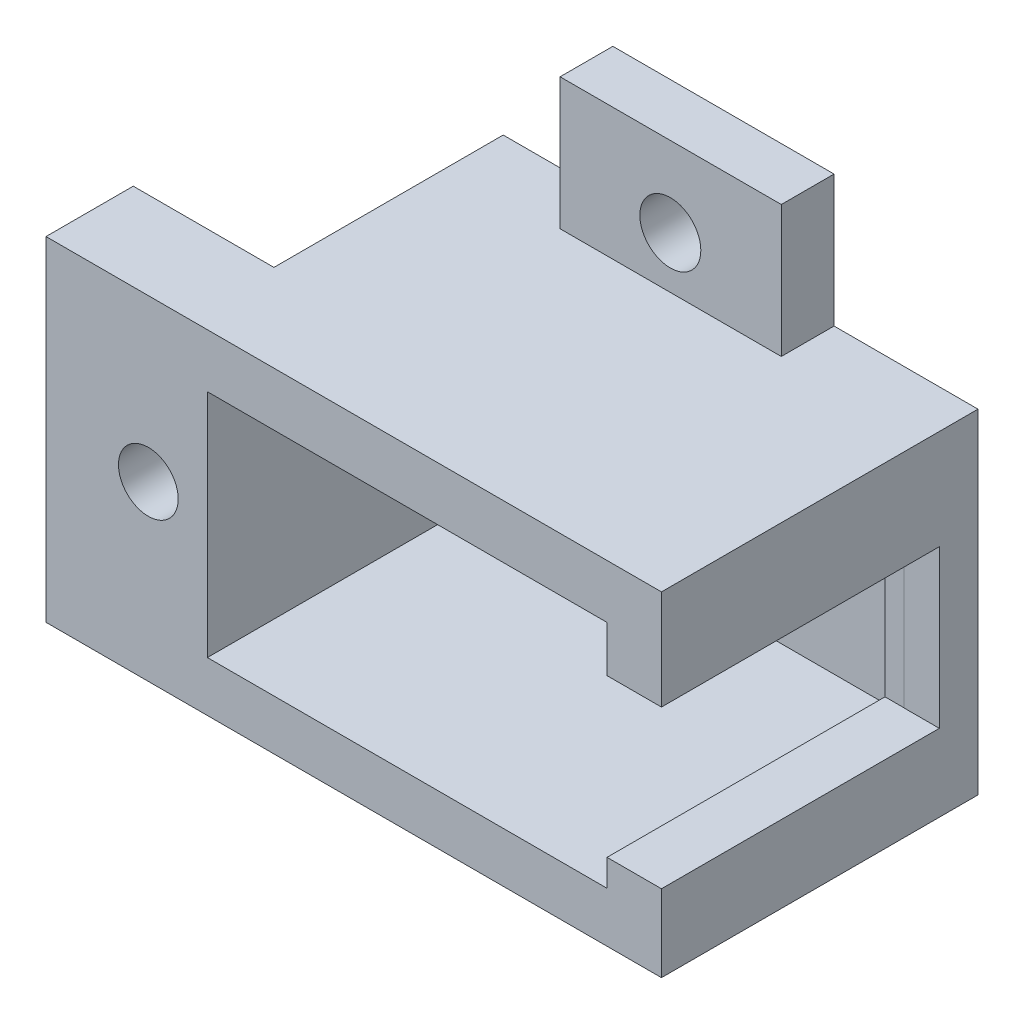
ISO-10303-21;
HEADER;
FILE_DESCRIPTION(('STEP AP214'),'2;1');
FILE_NAME('part.step','',(''),(''),'','','');
FILE_SCHEMA(('AUTOMOTIVE_DESIGN { 1 0 10303 214 1 1 1 1 }'));
ENDSEC;
DATA;
#1=APPLICATION_CONTEXT('core data for automotive mechanical design processes');
#2=APPLICATION_PROTOCOL_DEFINITION('international standard','automotive_design',2000,#1);
#3=PRODUCT_CONTEXT('',#1,'mechanical');
#4=PRODUCT('Part','Part','',(#3));
#5=PRODUCT_RELATED_PRODUCT_CATEGORY('part','',(#4));
#6=PRODUCT_DEFINITION_FORMATION('','',#4);
#7=PRODUCT_DEFINITION_CONTEXT('part definition',#1,'design');
#8=PRODUCT_DEFINITION('design','',#6,#7);
#9=PRODUCT_DEFINITION_SHAPE('','',#8);
#10=(LENGTH_UNIT() NAMED_UNIT(*) SI_UNIT(.MILLI.,.METRE.));
#11=(NAMED_UNIT(*) PLANE_ANGLE_UNIT() SI_UNIT($,.RADIAN.));
#12=(NAMED_UNIT(*) SI_UNIT($,.STERADIAN.) SOLID_ANGLE_UNIT());
#13=UNCERTAINTY_MEASURE_WITH_UNIT(LENGTH_MEASURE(1.E-05),#10,'distance_accuracy_value','');
#14=(GEOMETRIC_REPRESENTATION_CONTEXT(3) GLOBAL_UNCERTAINTY_ASSIGNED_CONTEXT((#13)) GLOBAL_UNIT_ASSIGNED_CONTEXT((#10,
#11,#12)) REPRESENTATION_CONTEXT('',''));
#15=CARTESIAN_POINT('',(0.,0.,0.));
#16=DIRECTION('',(0.,0.,1.));
#17=DIRECTION('',(1.,0.,0.));
#18=AXIS2_PLACEMENT_3D('',#15,#16,#17);
#19=CARTESIAN_POINT('',(15.765044467206,3.61114655957594,-4.39481093357821));
#20=DIRECTION('',(0.,0.,-1.));
#21=DIRECTION('',(-1.,0.,0.));
#22=AXIS2_PLACEMENT_3D('',#19,#20,#21);
#23=PLANE('',#22);
#24=DIRECTION('',(-1.,0.,0.));
#25=VECTOR('',#24,1.);
#26=CARTESIAN_POINT('',(15.765044467206,-5.37848533763323,-4.39481093357821));
#27=LINE('',#26,#25);
#28=CARTESIAN_POINT('',(15.765044467206,-5.37848533763323,-4.39481093357821));
#29=VERTEX_POINT('',#28);
#30=CARTESIAN_POINT('',(13.765044467206,-5.37848533763323,-4.39481093357821));
#31=VERTEX_POINT('',#30);
#32=EDGE_CURVE('E242',#29,#31,#27,.T.);
#33=ORIENTED_EDGE('',*,*,#32,.F.);
#34=DIRECTION('',(0.,-1.,0.));
#35=VECTOR('',#34,1.);
#36=CARTESIAN_POINT('',(15.765044467206,3.61114655957594,-4.39481093357821));
#37=LINE('',#36,#35);
#38=CARTESIAN_POINT('',(15.765044467206,3.56829534441516,-4.39481093357821));
#39=VERTEX_POINT('',#38);
#40=EDGE_CURVE('E54',#39,#29,#37,.T.);
#41=ORIENTED_EDGE('',*,*,#40,.F.);
#42=DIRECTION('',(-1.,0.,0.));
#43=VECTOR('',#42,1.);
#44=CARTESIAN_POINT('',(15.765044467206,3.56829534441516,-4.39481093357821));
#45=LINE('',#44,#43);
#46=CARTESIAN_POINT('',(13.765044467206,3.56829534441516,-4.39481093357821));
#47=VERTEX_POINT('',#46);
#48=EDGE_CURVE('E263',#39,#47,#45,.T.);
#49=ORIENTED_EDGE('',*,*,#48,.T.);
#50=DIRECTION('',(0.,-1.,0.));
#51=VECTOR('',#50,1.);
#52=CARTESIAN_POINT('',(13.765044467206,3.61114655957594,-4.39481093357821));
#53=LINE('',#52,#51);
#54=EDGE_CURVE('E250',#47,#31,#53,.T.);
#55=ORIENTED_EDGE('',*,*,#54,.T.);
#56=EDGE_LOOP('',(#33,#41,#49,#55));
#57=FACE_BOUND('',#56,.T.);
#58=ADVANCED_FACE('F39',(#57),#23,.F.);
#59=CARTESIAN_POINT('',(-11.234955532794,7.24184402230154,11.4057814046615));
#60=DIRECTION('',(1.,0.,0.));
#61=DIRECTION('',(0.,1.,0.));
#62=AXIS2_PLACEMENT_3D('',#59,#60,#61);
#63=PLANE('',#62);
#64=DIRECTION('',(0.,0.,-1.));
#65=VECTOR('',#64,1.);
#66=CARTESIAN_POINT('',(-11.234955532794,-9.75815597769846,-6.59421859533854));
#67=LINE('',#66,#65);
#68=CARTESIAN_POINT('',(-11.234955532794,-9.75815597769846,6.44388486915318));
#69=VERTEX_POINT('',#68);
#70=CARTESIAN_POINT('',(-11.234955532794,-9.75815597769846,-6.59421859533854));
#71=VERTEX_POINT('',#70);
#72=EDGE_CURVE('E295',#69,#71,#67,.T.);
#73=ORIENTED_EDGE('',*,*,#72,.F.);
#74=DIRECTION('',(0.,-1.,0.));
#75=VECTOR('',#74,1.);
#76=CARTESIAN_POINT('',(-11.234955532794,7.24184402230154,6.44388486915317));
#77=LINE('',#76,#75);
#78=CARTESIAN_POINT('',(-11.234955532794,9.24184402230154,6.44388486915317));
#79=VERTEX_POINT('',#78);
#80=EDGE_CURVE('E62',#79,#69,#77,.T.);
#81=ORIENTED_EDGE('',*,*,#80,.F.);
#82=DIRECTION('',(0.,0.,1.));
#83=VECTOR('',#82,1.);
#84=CARTESIAN_POINT('',(-11.234955532794,9.24184402230154,-6.59421859533854));
#85=LINE('',#84,#83);
#86=CARTESIAN_POINT('',(-11.234955532794,9.24184402230154,-6.59421859533854));
#87=VERTEX_POINT('',#86);
#88=EDGE_CURVE('E307',#87,#79,#85,.T.);
#89=ORIENTED_EDGE('',*,*,#88,.F.);
#90=DIRECTION('',(0.,-1.,0.));
#91=VECTOR('',#90,1.);
#92=CARTESIAN_POINT('',(-11.234955532794,7.24184402230154,-6.59421859533854));
#93=LINE('',#92,#91);
#94=EDGE_CURVE('E455',#87,#71,#93,.T.);
#95=ORIENTED_EDGE('',*,*,#94,.T.);
#96=EDGE_LOOP('',(#73,#81,#89,#95));
#97=FACE_BOUND('',#96,.T.);
#98=ADVANCED_FACE('F41',(#97),#63,.F.);
#99=CARTESIAN_POINT('',(-5.00001989462362,-7.75815597769846,-3.59421859533854));
#100=DIRECTION('',(-1.,0.,0.));
#101=DIRECTION('',(0.,-1.,0.));
#102=AXIS2_PLACEMENT_3D('',#99,#100,#101);
#103=PLANE('',#102);
#104=DIRECTION('',(0.,1.,0.));
#105=VECTOR('',#104,1.);
#106=CARTESIAN_POINT('',(-5.00001989462362,-7.75815597769846,-3.59421859533854));
#107=LINE('',#106,#105);
#108=CARTESIAN_POINT('',(-5.00001989462362,-17.2436749566738,-3.59421859533854));
#109=VERTEX_POINT('',#108);
#110=CARTESIAN_POINT('',(-5.00001989462362,-9.75815597769846,-3.59421859533854));
#111=VERTEX_POINT('',#110);
#112=EDGE_CURVE('E337',#109,#111,#107,.T.);
#113=ORIENTED_EDGE('',*,*,#112,.T.);
#114=DIRECTION('',(0.,0.,-1.));
#115=VECTOR('',#114,1.);
#116=CARTESIAN_POINT('',(-5.00001989462362,-9.75815597769846,-3.59421859533854));
#117=LINE('',#116,#115);
#118=CARTESIAN_POINT('',(-5.00001989462362,-9.75815597769846,-6.59421859533854));
#119=VERTEX_POINT('',#118);
#120=EDGE_CURVE('E303',#111,#119,#117,.T.);
#121=ORIENTED_EDGE('',*,*,#120,.T.);
#122=DIRECTION('',(0.,1.,0.));
#123=VECTOR('',#122,1.);
#124=CARTESIAN_POINT('',(-5.00001989462362,-7.75815597769846,-6.59421859533854));
#125=LINE('',#124,#123);
#126=CARTESIAN_POINT('',(-5.00001989462362,-17.2436749566738,-6.59421859533854));
#127=VERTEX_POINT('',#126);
#128=EDGE_CURVE('E334',#127,#119,#125,.T.);
#129=ORIENTED_EDGE('',*,*,#128,.F.);
#130=DIRECTION('',(0.,0.,-1.));
#131=VECTOR('',#130,1.);
#132=CARTESIAN_POINT('',(-5.00001989462362,-17.2436749566738,-3.59421859533854));
#133=LINE('',#132,#131);
#134=EDGE_CURVE('E347',#109,#127,#133,.T.);
#135=ORIENTED_EDGE('',*,*,#134,.F.);
#136=EDGE_LOOP('',(#113,#121,#129,#135));
#137=FACE_BOUND('',#136,.T.);
#138=ADVANCED_FACE('F567',(#137),#103,.T.);
#139=CARTESIAN_POINT('',(0.,0.,-3.59421859533854));
#140=DIRECTION('',(0.,0.,-1.));
#141=DIRECTION('',(-1.,0.,0.));
#142=AXIS2_PLACEMENT_3D('',#139,#140,#141);
#143=PLANE('',#142);
#144=CARTESIAN_POINT('',(1.26857420389281,-12.8934540258685,-3.59421859533854));
#145=DIRECTION('',(0.,0.,1.));
#146=DIRECTION('',(-1.,0.,0.));
#147=AXIS2_PLACEMENT_3D('',#144,#145,#146);
#148=CIRCLE('',#147,1.73347448185825);
#149=CARTESIAN_POINT('',(-0.464900277965436,-12.8934540258685,-3.59421859533854));
#150=VERTEX_POINT('',#149);
#151=EDGE_CURVE('E318',#150,#150,#148,.T.);
#152=ORIENTED_EDGE('',*,*,#151,.F.);
#153=EDGE_LOOP('',(#152));
#154=FACE_BOUND('',#153,.T.);
#155=DIRECTION('',(0.,-1.,0.));
#156=VECTOR('',#155,1.);
#157=CARTESIAN_POINT('',(7.57965810709038,-7.75815597769846,-3.59421859533854));
#158=LINE('',#157,#156);
#159=CARTESIAN_POINT('',(7.57965810709038,-9.75815597769846,-3.59421859533854));
#160=VERTEX_POINT('',#159);
#161=CARTESIAN_POINT('',(7.57965810709038,-17.2436749566738,-3.59421859533854));
#162=VERTEX_POINT('',#161);
#163=EDGE_CURVE('E331',#160,#162,#158,.T.);
#164=ORIENTED_EDGE('',*,*,#163,.F.);
#165=DIRECTION('',(1.,0.,0.));
#166=VECTOR('',#165,1.);
#167=CARTESIAN_POINT('',(0.,-9.75815597769846,-3.59421859533854));
#168=LINE('',#167,#166);
#169=EDGE_CURVE('E11',#111,#160,#168,.T.);
#170=ORIENTED_EDGE('',*,*,#169,.F.);
#171=ORIENTED_EDGE('',*,*,#112,.F.);
#172=DIRECTION('',(-1.,0.,0.));
#173=VECTOR('',#172,1.);
#174=CARTESIAN_POINT('',(7.57965810709038,-17.2436749566738,-3.59421859533854));
#175=LINE('',#174,#173);
#176=EDGE_CURVE('E333',#162,#109,#175,.T.);
#177=ORIENTED_EDGE('',*,*,#176,.F.);
#178=EDGE_LOOP('',(#164,#170,#171,#177));
#179=FACE_BOUND('',#178,.T.);
#180=ADVANCED_FACE('F589',(#154,#179),#143,.F.);
#181=CARTESIAN_POINT('',(0.,0.,-3.59421859533854));
#182=DIRECTION('',(0.,0.,1.));
#183=DIRECTION('',(1.,0.,0.));
#184=AXIS2_PLACEMENT_3D('',#181,#182,#183);
#185=PLANE('',#184);
#186=DIRECTION('',(-1.,0.,0.));
#187=VECTOR('',#186,1.);
#188=CARTESIAN_POINT('',(0.,9.24184402230154,-3.59421859533854));
#189=LINE('',#188,#187);
#190=CARTESIAN_POINT('',(7.57965810709038,9.24184402230154,-3.59421859533854));
#191=VERTEX_POINT('',#190);
#192=CARTESIAN_POINT('',(-5.00001989462362,9.24184402230154,-3.59421859533854));
#193=VERTEX_POINT('',#192);
#194=EDGE_CURVE('E491',#191,#193,#189,.T.);
#195=ORIENTED_EDGE('',*,*,#194,.F.);
#196=DIRECTION('',(0.,-1.,0.));
#197=VECTOR('',#196,1.);
#198=CARTESIAN_POINT('',(7.57965810709038,7.24184402230154,-3.59421859533854));
#199=LINE('',#198,#197);
#200=CARTESIAN_POINT('',(7.57965810709038,16.7273630012769,-3.59421859533854));
#201=VERTEX_POINT('',#200);
#202=EDGE_CURVE('E352',#201,#191,#199,.T.);
#203=ORIENTED_EDGE('',*,*,#202,.F.);
#204=DIRECTION('',(1.,0.,0.));
#205=VECTOR('',#204,1.);
#206=CARTESIAN_POINT('',(7.57965810709038,16.7273630012769,-3.59421859533854));
#207=LINE('',#206,#205);
#208=CARTESIAN_POINT('',(-5.00001989462362,16.7273630012769,-3.59421859533854));
#209=VERTEX_POINT('',#208);
#210=EDGE_CURVE('E358',#209,#201,#207,.T.);
#211=ORIENTED_EDGE('',*,*,#210,.F.);
#212=DIRECTION('',(0.,1.,0.));
#213=VECTOR('',#212,1.);
#214=CARTESIAN_POINT('',(-5.00001989462362,7.24184402230154,-3.59421859533854));
#215=LINE('',#214,#213);
#216=EDGE_CURVE('E355',#193,#209,#215,.T.);
#217=ORIENTED_EDGE('',*,*,#216,.F.);
#218=EDGE_LOOP('',(#195,#203,#211,#217));
#219=FACE_BOUND('',#218,.T.);
#220=CARTESIAN_POINT('',(1.26857420389281,12.1796538918355,-3.59421859533854));
#221=DIRECTION('',(0.,0.,1.));
#222=DIRECTION('',(1.,0.,0.));
#223=AXIS2_PLACEMENT_3D('',#220,#221,#222);
#224=CIRCLE('',#223,1.73347448185825);
#225=CARTESIAN_POINT('',(3.00204868575106,12.1796538918355,-3.59421859533854));
#226=VERTEX_POINT('',#225);
#227=EDGE_CURVE('E319',#226,#226,#224,.T.);
#228=ORIENTED_EDGE('',*,*,#227,.F.);
#229=EDGE_LOOP('',(#228));
#230=FACE_BOUND('',#229,.T.);
#231=ADVANCED_FACE('F515',(#219,#230),#185,.T.);
#232=CARTESIAN_POINT('',(7.57965810709038,7.24184402230154,-3.59421859533854));
#233=DIRECTION('',(1.,0.,0.));
#234=DIRECTION('',(0.,0.,-1.));
#235=AXIS2_PLACEMENT_3D('',#232,#233,#234);
#236=PLANE('',#235);
#237=ORIENTED_EDGE('',*,*,#202,.T.);
#238=DIRECTION('',(0.,0.,-1.));
#239=VECTOR('',#238,1.);
#240=CARTESIAN_POINT('',(7.57965810709038,9.24184402230154,-3.59421859533854));
#241=LINE('',#240,#239);
#242=CARTESIAN_POINT('',(7.57965810709038,9.24184402230154,-6.59421859533854));
#243=VERTEX_POINT('',#242);
#244=EDGE_CURVE('E47',#191,#243,#241,.T.);
#245=ORIENTED_EDGE('',*,*,#244,.T.);
#246=DIRECTION('',(0.,-1.,0.));
#247=VECTOR('',#246,1.);
#248=CARTESIAN_POINT('',(7.57965810709038,7.24184402230154,-6.59421859533854));
#249=LINE('',#248,#247);
#250=CARTESIAN_POINT('',(7.57965810709038,16.7273630012769,-6.59421859533854));
#251=VERTEX_POINT('',#250);
#252=EDGE_CURVE('E349',#251,#243,#249,.T.);
#253=ORIENTED_EDGE('',*,*,#252,.F.);
#254=DIRECTION('',(0.,0.,-1.));
#255=VECTOR('',#254,1.);
#256=CARTESIAN_POINT('',(7.57965810709038,16.7273630012769,-3.59421859533854));
#257=LINE('',#256,#255);
#258=EDGE_CURVE('E368',#201,#251,#257,.T.);
#259=ORIENTED_EDGE('',*,*,#258,.F.);
#260=EDGE_LOOP('',(#237,#245,#253,#259));
#261=FACE_BOUND('',#260,.T.);
#262=ADVANCED_FACE('F499',(#261),#236,.T.);
#263=CARTESIAN_POINT('',(-0.302392135283335,-1.10871409180262,11.4057814046615));
#264=DIRECTION('',(0.,0.,1.));
#265=DIRECTION('',(1.,0.,0.));
#266=AXIS2_PLACEMENT_3D('',#263,#264,#265);
#267=PLANE('',#266);
#268=DIRECTION('',(-1.,0.,0.));
#269=VECTOR('',#268,1.);
#270=CARTESIAN_POINT('',(-11.234955532794,-9.75815597769846,11.4057814046615));
#271=LINE('',#270,#269);
#272=CARTESIAN_POINT('',(15.765044467206,-9.75815597769846,11.4057814046615));
#273=VERTEX_POINT('',#272);
#274=CARTESIAN_POINT('',(-19.234955532794,-9.75815597769846,11.4057814046615));
#275=VERTEX_POINT('',#274);
#276=EDGE_CURVE('E300',#273,#275,#271,.T.);
#277=ORIENTED_EDGE('',*,*,#276,.F.);
#278=DIRECTION('',(0.,-1.,0.));
#279=VECTOR('',#278,1.);
#280=CARTESIAN_POINT('',(15.765044467206,-9.75815597769846,11.4057814046615));
#281=LINE('',#280,#279);
#282=CARTESIAN_POINT('',(15.765044467206,-5.37848533763323,11.4057814046615));
#283=VERTEX_POINT('',#282);
#284=EDGE_CURVE('E272',#283,#273,#281,.T.);
#285=ORIENTED_EDGE('',*,*,#284,.F.);
#286=DIRECTION('',(1.,0.,0.));
#287=VECTOR('',#286,1.);
#288=CARTESIAN_POINT('',(-0.302392135283334,-5.37848533763324,11.4057814046615));
#289=LINE('',#288,#287);
#290=CARTESIAN_POINT('',(12.6697682633816,-5.37848533763323,11.4057814046615));
#291=VERTEX_POINT('',#290);
#292=EDGE_CURVE('E245',#291,#283,#289,.T.);
#293=ORIENTED_EDGE('',*,*,#292,.F.);
#294=DIRECTION('',(0.,1.,0.));
#295=VECTOR('',#294,1.);
#296=CARTESIAN_POINT('',(12.6697682633816,6.18977975014847,11.4057814046615));
#297=LINE('',#296,#295);
#298=CARTESIAN_POINT('',(12.6697682633816,-6.90357988418142,11.4057814046615));
#299=VERTEX_POINT('',#298);
#300=EDGE_CURVE('E448',#299,#291,#297,.T.);
#301=ORIENTED_EDGE('',*,*,#300,.F.);
#302=DIRECTION('',(1.,0.,0.));
#303=VECTOR('',#302,1.);
#304=CARTESIAN_POINT('',(-10.0573234596219,-6.90357988418142,11.4057814046615));
#305=LINE('',#304,#303);
#306=CARTESIAN_POINT('',(-10.0573234596219,-6.90357988418142,11.4057814046615));
#307=VERTEX_POINT('',#306);
#308=EDGE_CURVE('E444',#307,#299,#305,.T.);
#309=ORIENTED_EDGE('',*,*,#308,.F.);
#310=DIRECTION('',(0.,-1.,0.));
#311=VECTOR('',#310,1.);
#312=CARTESIAN_POINT('',(-10.0573234596219,6.18977975014847,11.4057814046615));
#313=LINE('',#312,#311);
#314=CARTESIAN_POINT('',(-10.0573234596219,6.18977975014847,11.4057814046615));
#315=VERTEX_POINT('',#314);
#316=EDGE_CURVE('E405',#315,#307,#313,.T.);
#317=ORIENTED_EDGE('',*,*,#316,.F.);
#318=DIRECTION('',(-1.,0.,0.));
#319=VECTOR('',#318,1.);
#320=CARTESIAN_POINT('',(-10.0573234596219,6.18977975014847,11.4057814046615));
#321=LINE('',#320,#319);
#322=CARTESIAN_POINT('',(12.6697682633816,6.18977975014847,11.4057814046615));
#323=VERTEX_POINT('',#322);
#324=EDGE_CURVE('E433',#323,#315,#321,.T.);
#325=ORIENTED_EDGE('',*,*,#324,.F.);
#326=CARTESIAN_POINT('',(12.6697682633816,3.56829534441516,11.4057814046615));
#327=VERTEX_POINT('',#326);
#328=EDGE_CURVE('E447',#327,#323,#297,.T.);
#329=ORIENTED_EDGE('',*,*,#328,.F.);
#330=DIRECTION('',(-1.,0.,0.));
#331=VECTOR('',#330,1.);
#332=CARTESIAN_POINT('',(-0.302392135283337,3.56829534441516,11.4057814046615));
#333=LINE('',#332,#331);
#334=CARTESIAN_POINT('',(15.765044467206,3.56829534441516,11.4057814046615));
#335=VERTEX_POINT('',#334);
#336=EDGE_CURVE('E385',#335,#327,#333,.T.);
#337=ORIENTED_EDGE('',*,*,#336,.F.);
#338=DIRECTION('',(0.,-1.,0.));
#339=VECTOR('',#338,1.);
#340=CARTESIAN_POINT('',(15.765044467206,9.24184402230154,11.4057814046615));
#341=LINE('',#340,#339);
#342=CARTESIAN_POINT('',(15.765044467206,9.24184402230154,11.4057814046615));
#343=VERTEX_POINT('',#342);
#344=EDGE_CURVE('E261',#343,#335,#341,.T.);
#345=ORIENTED_EDGE('',*,*,#344,.F.);
#346=DIRECTION('',(1.,0.,0.));
#347=VECTOR('',#346,1.);
#348=CARTESIAN_POINT('',(-11.234955532794,9.24184402230154,11.4057814046615));
#349=LINE('',#348,#347);
#350=CARTESIAN_POINT('',(-19.234955532794,9.24184402230154,11.4057814046615));
#351=VERTEX_POINT('',#350);
#352=EDGE_CURVE('E310',#351,#343,#349,.T.);
#353=ORIENTED_EDGE('',*,*,#352,.F.);
#354=DIRECTION('',(0.,1.,0.));
#355=VECTOR('',#354,1.);
#356=CARTESIAN_POINT('',(-19.234955532794,7.24184402230154,11.4057814046615));
#357=LINE('',#356,#355);
#358=EDGE_CURVE('E378',#275,#351,#357,.T.);
#359=ORIENTED_EDGE('',*,*,#358,.F.);
#360=EDGE_LOOP('',(#277,#285,#293,#301,#309,#317,#325,#329,#337,#345,#353,#359));
#361=FACE_BOUND('',#360,.T.);
#362=CARTESIAN_POINT('',(-13.4157227054902,0.0718147513168632,11.4057814046615));
#363=DIRECTION('',(0.,0.,1.));
#364=DIRECTION('',(1.,0.,0.));
#365=AXIS2_PLACEMENT_3D('',#362,#363,#364);
#366=CIRCLE('',#365,1.69875448416165);
#367=CARTESIAN_POINT('',(-11.7169682213285,0.0718147513168632,11.4057814046615));
#368=VERTEX_POINT('',#367);
#369=EDGE_CURVE('E370',#368,#368,#366,.T.);
#370=ORIENTED_EDGE('',*,*,#369,.F.);
#371=EDGE_LOOP('',(#370));
#372=FACE_BOUND('',#371,.T.);
#373=ADVANCED_FACE('F531',(#361,#372),#267,.T.);
#374=CARTESIAN_POINT('',(-0.302392135283335,-1.10871409180262,-6.59421859533854));
#375=DIRECTION('',(0.,0.,1.));
#376=DIRECTION('',(1.,0.,0.));
#377=AXIS2_PLACEMENT_3D('',#374,#375,#376);
#378=PLANE('',#377);
#379=DIRECTION('',(1.,0.,0.));
#380=VECTOR('',#379,1.);
#381=CARTESIAN_POINT('',(13.765044467206,-9.75815597769846,-6.59421859533854));
#382=LINE('',#381,#380);
#383=CARTESIAN_POINT('',(7.57965810709038,-9.75815597769846,-6.59421859533854));
#384=VERTEX_POINT('',#383);
#385=CARTESIAN_POINT('',(15.765044467206,-9.75815597769846,-6.59421859533854));
#386=VERTEX_POINT('',#385);
#387=EDGE_CURVE('E293',#384,#386,#382,.T.);
#388=ORIENTED_EDGE('',*,*,#387,.F.);
#389=DIRECTION('',(0.,-1.,0.));
#390=VECTOR('',#389,1.);
#391=CARTESIAN_POINT('',(7.57965810709038,-7.75815597769846,-6.59421859533854));
#392=LINE('',#391,#390);
#393=CARTESIAN_POINT('',(7.57965810709038,-17.2436749566738,-6.59421859533854));
#394=VERTEX_POINT('',#393);
#395=EDGE_CURVE('E330',#384,#394,#392,.T.);
#396=ORIENTED_EDGE('',*,*,#395,.T.);
#397=DIRECTION('',(-1.,0.,0.));
#398=VECTOR('',#397,1.);
#399=CARTESIAN_POINT('',(7.57965810709038,-17.2436749566738,-6.59421859533854));
#400=LINE('',#399,#398);
#401=EDGE_CURVE('E342',#394,#127,#400,.T.);
#402=ORIENTED_EDGE('',*,*,#401,.T.);
#403=ORIENTED_EDGE('',*,*,#128,.T.);
#404=DIRECTION('',(1.,0.,0.));
#405=VECTOR('',#404,1.);
#406=CARTESIAN_POINT('',(-11.234955532794,-9.75815597769846,-6.59421859533854));
#407=LINE('',#406,#405);
#408=EDGE_CURVE('E297',#71,#119,#407,.T.);
#409=ORIENTED_EDGE('',*,*,#408,.F.);
#410=ORIENTED_EDGE('',*,*,#94,.F.);
#411=DIRECTION('',(-1.,0.,0.));
#412=VECTOR('',#411,1.);
#413=CARTESIAN_POINT('',(-11.234955532794,9.24184402230154,-6.59421859533854));
#414=LINE('',#413,#412);
#415=CARTESIAN_POINT('',(-5.00001989462362,9.24184402230154,-6.59421859533854));
#416=VERTEX_POINT('',#415);
#417=EDGE_CURVE('E312',#416,#87,#414,.T.);
#418=ORIENTED_EDGE('',*,*,#417,.F.);
#419=DIRECTION('',(0.,1.,0.));
#420=VECTOR('',#419,1.);
#421=CARTESIAN_POINT('',(-5.00001989462362,7.24184402230154,-6.59421859533854));
#422=LINE('',#421,#420);
#423=CARTESIAN_POINT('',(-5.00001989462362,16.7273630012769,-6.59421859533854));
#424=VERTEX_POINT('',#423);
#425=EDGE_CURVE('E364',#416,#424,#422,.T.);
#426=ORIENTED_EDGE('',*,*,#425,.T.);
#427=DIRECTION('',(1.,0.,0.));
#428=VECTOR('',#427,1.);
#429=CARTESIAN_POINT('',(7.57965810709038,16.7273630012769,-6.59421859533854));
#430=LINE('',#429,#428);
#431=EDGE_CURVE('E356',#424,#251,#430,.T.);
#432=ORIENTED_EDGE('',*,*,#431,.T.);
#433=ORIENTED_EDGE('',*,*,#252,.T.);
#434=DIRECTION('',(-1.,0.,0.));
#435=VECTOR('',#434,1.);
#436=CARTESIAN_POINT('',(13.765044467206,9.24184402230154,-6.59421859533854));
#437=LINE('',#436,#435);
#438=CARTESIAN_POINT('',(15.765044467206,9.24184402230154,-6.59421859533854));
#439=VERTEX_POINT('',#438);
#440=EDGE_CURVE('E305',#439,#243,#437,.T.);
#441=ORIENTED_EDGE('',*,*,#440,.F.);
#442=DIRECTION('',(0.,1.,0.));
#443=VECTOR('',#442,1.);
#444=CARTESIAN_POINT('',(15.765044467206,-9.75815597769846,-6.59421859533854));
#445=LINE('',#444,#443);
#446=EDGE_CURVE('E277',#386,#439,#445,.T.);
#447=ORIENTED_EDGE('',*,*,#446,.F.);
#448=EDGE_LOOP('',(#388,#396,#402,#403,#409,#410,#418,#426,#432,#433,#441,#447));
#449=FACE_BOUND('',#448,.T.);
#450=CARTESIAN_POINT('',(1.26857420389281,12.1796538918355,-6.59421859533854));
#451=DIRECTION('',(0.,0.,1.));
#452=DIRECTION('',(1.,0.,0.));
#453=AXIS2_PLACEMENT_3D('',#450,#451,#452);
#454=CIRCLE('',#453,1.73347448185825);
#455=CARTESIAN_POINT('',(3.00204868575106,12.1796538918355,-6.59421859533854));
#456=VERTEX_POINT('',#455);
#457=EDGE_CURVE('E327',#456,#456,#454,.T.);
#458=ORIENTED_EDGE('',*,*,#457,.T.);
#459=EDGE_LOOP('',(#458));
#460=FACE_BOUND('',#459,.T.);
#461=CARTESIAN_POINT('',(1.26857420389281,-12.8934540258685,-6.59421859533854));
#462=DIRECTION('',(0.,0.,1.));
#463=DIRECTION('',(1.,0.,0.));
#464=AXIS2_PLACEMENT_3D('',#461,#462,#463);
#465=CIRCLE('',#464,1.73347448185825);
#466=CARTESIAN_POINT('',(3.00204868575106,-12.8934540258685,-6.59421859533854));
#467=VERTEX_POINT('',#466);
#468=EDGE_CURVE('E322',#467,#467,#465,.T.);
#469=ORIENTED_EDGE('',*,*,#468,.T.);
#470=EDGE_LOOP('',(#469));
#471=FACE_BOUND('',#470,.T.);
#472=ADVANCED_FACE('F504',(#449,#460,#471),#378,.F.);
#473=CARTESIAN_POINT('',(-10.0573234596219,6.18977975014847,-5.59421859533854));
#474=DIRECTION('',(-1.,0.,0.));
#475=DIRECTION('',(0.,0.,1.));
#476=AXIS2_PLACEMENT_3D('',#473,#474,#475);
#477=PLANE('',#476);
#478=ORIENTED_EDGE('',*,*,#316,.T.);
#479=DIRECTION('',(0.,0.,1.));
#480=VECTOR('',#479,1.);
#481=CARTESIAN_POINT('',(-10.0573234596219,-6.90357988418142,-5.59421859533854));
#482=LINE('',#481,#480);
#483=CARTESIAN_POINT('',(-10.0573234596219,-6.90357988418142,-5.59421859533854));
#484=VERTEX_POINT('',#483);
#485=EDGE_CURVE('E442',#484,#307,#482,.T.);
#486=ORIENTED_EDGE('',*,*,#485,.F.);
#487=DIRECTION('',(0.,-1.,0.));
#488=VECTOR('',#487,1.);
#489=CARTESIAN_POINT('',(-10.0573234596219,6.18977975014847,-5.59421859533854));
#490=LINE('',#489,#488);
#491=CARTESIAN_POINT('',(-10.0573234596219,6.18977975014847,-5.59421859533854));
#492=VERTEX_POINT('',#491);
#493=EDGE_CURVE('E429',#492,#484,#490,.T.);
#494=ORIENTED_EDGE('',*,*,#493,.F.);
#495=DIRECTION('',(0.,0.,1.));
#496=VECTOR('',#495,1.);
#497=CARTESIAN_POINT('',(-10.0573234596219,6.18977975014847,-5.59421859533854));
#498=LINE('',#497,#496);
#499=EDGE_CURVE('E453',#492,#315,#498,.T.);
#500=ORIENTED_EDGE('',*,*,#499,.T.);
#501=EDGE_LOOP('',(#478,#486,#494,#500));
#502=FACE_BOUND('',#501,.T.);
#503=ADVANCED_FACE('F620',(#502),#477,.F.);
#504=CARTESIAN_POINT('',(-10.0573234596219,6.18977975014847,-5.59421859533854));
#505=DIRECTION('',(0.,1.,0.));
#506=DIRECTION('',(0.,0.,1.));
#507=AXIS2_PLACEMENT_3D('',#504,#505,#506);
#508=PLANE('',#507);
#509=ORIENTED_EDGE('',*,*,#324,.T.);
#510=ORIENTED_EDGE('',*,*,#499,.F.);
#511=DIRECTION('',(-1.,0.,0.));
#512=VECTOR('',#511,1.);
#513=CARTESIAN_POINT('',(-10.0573234596219,6.18977975014847,-5.59421859533854));
#514=LINE('',#513,#512);
#515=CARTESIAN_POINT('',(12.6697682633816,6.18977975014847,-5.59421859533854));
#516=VERTEX_POINT('',#515);
#517=EDGE_CURVE('E439',#516,#492,#514,.T.);
#518=ORIENTED_EDGE('',*,*,#517,.F.);
#519=DIRECTION('',(0.,0.,1.));
#520=VECTOR('',#519,1.);
#521=CARTESIAN_POINT('',(12.6697682633816,6.18977975014847,-5.59421859533854));
#522=LINE('',#521,#520);
#523=EDGE_CURVE('E456',#516,#323,#522,.T.);
#524=ORIENTED_EDGE('',*,*,#523,.T.);
#525=EDGE_LOOP('',(#509,#510,#518,#524));
#526=FACE_BOUND('',#525,.T.);
#527=ADVANCED_FACE('F624',(#526),#508,.F.);
#528=CARTESIAN_POINT('',(12.6697682633816,6.18977975014847,-5.59421859533854));
#529=DIRECTION('',(1.,0.,0.));
#530=DIRECTION('',(0.,0.,-1.));
#531=AXIS2_PLACEMENT_3D('',#528,#529,#530);
#532=PLANE('',#531);
#533=DIRECTION('',(0.,0.,1.));
#534=VECTOR('',#533,1.);
#535=CARTESIAN_POINT('',(12.6697682633816,-5.69878390215777,-5.59421859533854));
#536=LINE('',#535,#534);
#537=CARTESIAN_POINT('',(12.6697682633816,-5.69878390215777,-3.69179620034604));
#538=VERTEX_POINT('',#537);
#539=CARTESIAN_POINT('',(12.6697682633816,-5.69878390215777,-3.6721417845445));
#540=VERTEX_POINT('',#539);
#541=EDGE_CURVE('E482',#538,#540,#536,.T.);
#542=ORIENTED_EDGE('',*,*,#541,.T.);
#543=DIRECTION('',(0.,-1.,0.));
#544=VECTOR('',#543,1.);
#545=CARTESIAN_POINT('',(12.6697682633816,6.18977975014847,-3.6721417845445));
#546=LINE('',#545,#544);
#547=CARTESIAN_POINT('',(12.6697682633816,-5.72542720175988,-3.6721417845445));
#548=VERTEX_POINT('',#547);
#549=EDGE_CURVE('E485',#540,#548,#546,.T.);
#550=ORIENTED_EDGE('',*,*,#549,.T.);
#551=DIRECTION('',(0.,0.,-1.));
#552=VECTOR('',#551,1.);
#553=CARTESIAN_POINT('',(12.6697682633816,-5.72542720175988,-5.59421859533854));
#554=LINE('',#553,#552);
#555=CARTESIAN_POINT('',(12.6697682633816,-5.72542720175988,-3.69179620034604));
#556=VERTEX_POINT('',#555);
#557=EDGE_CURVE('E476',#548,#556,#554,.T.);
#558=ORIENTED_EDGE('',*,*,#557,.T.);
#559=DIRECTION('',(0.,1.,0.));
#560=VECTOR('',#559,1.);
#561=CARTESIAN_POINT('',(12.6697682633816,6.18977975014847,-3.69179620034604));
#562=LINE('',#561,#560);
#563=EDGE_CURVE('E479',#556,#538,#562,.T.);
#564=ORIENTED_EDGE('',*,*,#563,.T.);
#565=EDGE_LOOP('',(#542,#550,#558,#564));
#566=FACE_BOUND('',#565,.T.);
#567=DIRECTION('',(0.,-1.,0.));
#568=VECTOR('',#567,1.);
#569=CARTESIAN_POINT('',(12.6697682633816,6.18977975014847,10.0898663602042));
#570=LINE('',#569,#568);
#571=CARTESIAN_POINT('',(12.6697682633816,3.57911318346666,10.0898663602042));
#572=VERTEX_POINT('',#571);
#573=CARTESIAN_POINT('',(12.6697682633816,3.56829534441516,10.0898663602042));
#574=VERTEX_POINT('',#573);
#575=EDGE_CURVE('E468',#572,#574,#570,.T.);
#576=ORIENTED_EDGE('',*,*,#575,.T.);
#577=DIRECTION('',(0.,0.,1.));
#578=VECTOR('',#577,1.);
#579=CARTESIAN_POINT('',(12.6697682633816,3.56829534441516,-5.59421859533854));
#580=LINE('',#579,#578);
#581=EDGE_CURVE('E382',#574,#327,#580,.T.);
#582=ORIENTED_EDGE('',*,*,#581,.T.);
#583=ORIENTED_EDGE('',*,*,#328,.T.);
#584=ORIENTED_EDGE('',*,*,#523,.F.);
#585=DIRECTION('',(0.,1.,0.));
#586=VECTOR('',#585,1.);
#587=CARTESIAN_POINT('',(12.6697682633816,6.18977975014847,-5.59421859533854));
#588=LINE('',#587,#586);
#589=CARTESIAN_POINT('',(12.6697682633816,-6.90357988418142,-5.59421859533854));
#590=VERTEX_POINT('',#589);
#591=EDGE_CURVE('E436',#590,#516,#588,.T.);
#592=ORIENTED_EDGE('',*,*,#591,.F.);
#593=DIRECTION('',(0.,0.,1.));
#594=VECTOR('',#593,1.);
#595=CARTESIAN_POINT('',(12.6697682633816,-6.90357988418142,-5.59421859533854));
#596=LINE('',#595,#594);
#597=EDGE_CURVE('E459',#590,#299,#596,.T.);
#598=ORIENTED_EDGE('',*,*,#597,.T.);
#599=ORIENTED_EDGE('',*,*,#300,.T.);
#600=DIRECTION('',(0.,0.,-1.));
#601=VECTOR('',#600,1.);
#602=CARTESIAN_POINT('',(12.6697682633816,-5.37848533763323,-5.59421859533854));
#603=LINE('',#602,#601);
#604=CARTESIAN_POINT('',(12.6697682633816,-5.37848533763323,-4.40105183464073));
#605=VERTEX_POINT('',#604);
#606=EDGE_CURVE('E471',#291,#605,#603,.T.);
#607=ORIENTED_EDGE('',*,*,#606,.T.);
#608=DIRECTION('',(0.,1.,0.));
#609=VECTOR('',#608,1.);
#610=CARTESIAN_POINT('',(12.6697682633816,6.18977975014847,-4.40105183464073));
#611=LINE('',#610,#609);
#612=CARTESIAN_POINT('',(12.6697682633816,3.57911318346666,-4.40105183464073));
#613=VERTEX_POINT('',#612);
#614=EDGE_CURVE('E473',#605,#613,#611,.T.);
#615=ORIENTED_EDGE('',*,*,#614,.T.);
#616=DIRECTION('',(0.,0.,1.));
#617=VECTOR('',#616,1.);
#618=CARTESIAN_POINT('',(12.6697682633816,3.57911318346666,-5.59421859533854));
#619=LINE('',#618,#617);
#620=EDGE_CURVE('E465',#613,#572,#619,.T.);
#621=ORIENTED_EDGE('',*,*,#620,.T.);
#622=EDGE_LOOP('',(#576,#582,#583,#584,#592,#598,#599,#607,#615,#621));
#623=FACE_BOUND('',#622,.T.);
#624=ADVANCED_FACE('F630',(#566,#623),#532,.F.);
#625=CARTESIAN_POINT('',(-10.0573234596219,-6.90357988418142,-5.59421859533854));
#626=DIRECTION('',(0.,-1.,0.));
#627=DIRECTION('',(0.,0.,-1.));
#628=AXIS2_PLACEMENT_3D('',#625,#626,#627);
#629=PLANE('',#628);
#630=ORIENTED_EDGE('',*,*,#308,.T.);
#631=ORIENTED_EDGE('',*,*,#597,.F.);
#632=DIRECTION('',(1.,0.,0.));
#633=VECTOR('',#632,1.);
#634=CARTESIAN_POINT('',(-10.0573234596219,-6.90357988418142,-5.59421859533854));
#635=LINE('',#634,#633);
#636=EDGE_CURVE('E432',#484,#590,#635,.T.);
#637=ORIENTED_EDGE('',*,*,#636,.F.);
#638=ORIENTED_EDGE('',*,*,#485,.T.);
#639=EDGE_LOOP('',(#630,#631,#637,#638));
#640=FACE_BOUND('',#639,.T.);
#641=ADVANCED_FACE('F626',(#640),#629,.F.);
#642=CARTESIAN_POINT('',(-0.302392135283335,-1.10871409180262,-5.59421859533854));
#643=DIRECTION('',(0.,0.,1.));
#644=DIRECTION('',(1.,0.,0.));
#645=AXIS2_PLACEMENT_3D('',#642,#643,#644);
#646=PLANE('',#645);
#647=ORIENTED_EDGE('',*,*,#493,.T.);
#648=ORIENTED_EDGE('',*,*,#636,.T.);
#649=ORIENTED_EDGE('',*,*,#591,.T.);
#650=ORIENTED_EDGE('',*,*,#517,.T.);
#651=EDGE_LOOP('',(#647,#648,#649,#650));
#652=FACE_BOUND('',#651,.T.);
#653=ADVANCED_FACE('F629',(#652),#646,.T.);
#654=CARTESIAN_POINT('',(-4.23495553279398,-5.37848533763324,-4.40105183464073));
#655=DIRECTION('',(0.,0.,-1.));
#656=DIRECTION('',(-1.,0.,0.));
#657=AXIS2_PLACEMENT_3D('',#654,#655,#656);
#658=PLANE('',#657);
#659=DIRECTION('',(1.,0.,0.));
#660=VECTOR('',#659,1.);
#661=CARTESIAN_POINT('',(-4.23495553279398,-5.37848533763324,-4.40105183464073));
#662=LINE('',#661,#660);
#663=CARTESIAN_POINT('',(13.765044467206,-5.37848533763323,-4.40105183464073));
#664=VERTEX_POINT('',#663);
#665=EDGE_CURVE('E392',#605,#664,#662,.T.);
#666=ORIENTED_EDGE('',*,*,#665,.T.);
#667=DIRECTION('',(0.,1.,0.));
#668=VECTOR('',#667,1.);
#669=CARTESIAN_POINT('',(13.765044467206,-5.37848533763323,-4.40105183464073));
#670=LINE('',#669,#668);
#671=CARTESIAN_POINT('',(13.765044467206,3.57911318346666,-4.40105183464073));
#672=VERTEX_POINT('',#671);
#673=EDGE_CURVE('E387',#664,#672,#670,.T.);
#674=ORIENTED_EDGE('',*,*,#673,.T.);
#675=DIRECTION('',(1.,0.,0.));
#676=VECTOR('',#675,1.);
#677=CARTESIAN_POINT('',(-4.23495553279399,3.57911318346666,-4.40105183464073));
#678=LINE('',#677,#676);
#679=EDGE_CURVE('E421',#613,#672,#678,.T.);
#680=ORIENTED_EDGE('',*,*,#679,.F.);
#681=ORIENTED_EDGE('',*,*,#614,.F.);
#682=EDGE_LOOP('',(#666,#674,#680,#681));
#683=FACE_BOUND('',#682,.T.);
#684=ADVANCED_FACE('F640',(#683),#658,.F.);
#685=CARTESIAN_POINT('',(-4.23495553279398,-5.37848533763324,-4.40105183464073));
#686=DIRECTION('',(0.,-1.,0.));
#687=DIRECTION('',(1.,0.,0.));
#688=AXIS2_PLACEMENT_3D('',#685,#686,#687);
#689=PLANE('',#688);
#690=ORIENTED_EDGE('',*,*,#665,.F.);
#691=ORIENTED_EDGE('',*,*,#606,.F.);
#692=ORIENTED_EDGE('',*,*,#292,.T.);
#693=DIRECTION('',(0.,0.,1.));
#694=VECTOR('',#693,1.);
#695=CARTESIAN_POINT('',(15.765044467206,-5.37848533763323,11.4057814046615));
#696=LINE('',#695,#694);
#697=EDGE_CURVE('E238',#29,#283,#696,.T.);
#698=ORIENTED_EDGE('',*,*,#697,.F.);
#699=ORIENTED_EDGE('',*,*,#32,.T.);
#700=DIRECTION('',(0.,0.,-1.));
#701=VECTOR('',#700,1.);
#702=CARTESIAN_POINT('',(13.765044467206,-5.37848533763323,-4.40105183464073));
#703=LINE('',#702,#701);
#704=EDGE_CURVE('E259',#31,#664,#703,.T.);
#705=ORIENTED_EDGE('',*,*,#704,.T.);
#706=EDGE_LOOP('',(#690,#691,#692,#698,#699,#705));
#707=FACE_BOUND('',#706,.T.);
#708=ADVANCED_FACE('F240',(#707),#689,.F.);
#709=CARTESIAN_POINT('',(-4.23495553279398,-5.37848533763324,10.0898663602042));
#710=DIRECTION('',(0.,0.,1.));
#711=DIRECTION('',(1.,0.,0.));
#712=AXIS2_PLACEMENT_3D('',#709,#710,#711);
#713=PLANE('',#712);
#714=DIRECTION('',(0.,-1.,0.));
#715=VECTOR('',#714,1.);
#716=CARTESIAN_POINT('',(13.765044467206,-5.37848533763323,10.0898663602042));
#717=LINE('',#716,#715);
#718=CARTESIAN_POINT('',(13.765044467206,3.57911318346666,10.0898663602042));
#719=VERTEX_POINT('',#718);
#720=CARTESIAN_POINT('',(13.765044467206,3.56829534441516,10.0898663602042));
#721=VERTEX_POINT('',#720);
#722=EDGE_CURVE('E418',#719,#721,#717,.T.);
#723=ORIENTED_EDGE('',*,*,#722,.T.);
#724=DIRECTION('',(-1.,0.,0.));
#725=VECTOR('',#724,1.);
#726=CARTESIAN_POINT('',(-4.23495553279399,3.56829534441516,10.0898663602042));
#727=LINE('',#726,#725);
#728=EDGE_CURVE('E488',#721,#574,#727,.T.);
#729=ORIENTED_EDGE('',*,*,#728,.T.);
#730=ORIENTED_EDGE('',*,*,#575,.F.);
#731=DIRECTION('',(1.,0.,0.));
#732=VECTOR('',#731,1.);
#733=CARTESIAN_POINT('',(-4.23495553279399,3.57911318346666,10.0898663602042));
#734=LINE('',#733,#732);
#735=EDGE_CURVE('E424',#572,#719,#734,.T.);
#736=ORIENTED_EDGE('',*,*,#735,.T.);
#737=EDGE_LOOP('',(#723,#729,#730,#736));
#738=FACE_BOUND('',#737,.T.);
#739=ADVANCED_FACE('F649',(#738),#713,.F.);
#740=CARTESIAN_POINT('',(-4.23495553279399,3.57911318346666,-4.40105183464073));
#741=DIRECTION('',(0.,1.,0.));
#742=DIRECTION('',(-1.,0.,0.));
#743=AXIS2_PLACEMENT_3D('',#740,#741,#742);
#744=PLANE('',#743);
#745=ORIENTED_EDGE('',*,*,#679,.T.);
#746=DIRECTION('',(0.,0.,1.));
#747=VECTOR('',#746,1.);
#748=CARTESIAN_POINT('',(13.765044467206,3.57911318346666,-4.40105183464073));
#749=LINE('',#748,#747);
#750=EDGE_CURVE('E416',#672,#719,#749,.T.);
#751=ORIENTED_EDGE('',*,*,#750,.T.);
#752=ORIENTED_EDGE('',*,*,#735,.F.);
#753=ORIENTED_EDGE('',*,*,#620,.F.);
#754=EDGE_LOOP('',(#745,#751,#752,#753));
#755=FACE_BOUND('',#754,.T.);
#756=ADVANCED_FACE('F645',(#755),#744,.F.);
#757=CARTESIAN_POINT('',(-4.23495553279398,-5.72542720175989,-3.6721417845445));
#758=DIRECTION('',(0.,0.,1.));
#759=DIRECTION('',(1.,0.,0.));
#760=AXIS2_PLACEMENT_3D('',#757,#758,#759);
#761=PLANE('',#760);
#762=DIRECTION('',(1.,0.,0.));
#763=VECTOR('',#762,1.);
#764=CARTESIAN_POINT('',(-4.23495553279398,-5.69878390215777,-3.6721417845445));
#765=LINE('',#764,#763);
#766=CARTESIAN_POINT('',(13.765044467206,-5.69878390215777,-3.6721417845445));
#767=VERTEX_POINT('',#766);
#768=EDGE_CURVE('E402',#540,#767,#765,.T.);
#769=ORIENTED_EDGE('',*,*,#768,.T.);
#770=DIRECTION('',(0.,-1.,0.));
#771=VECTOR('',#770,1.);
#772=CARTESIAN_POINT('',(13.765044467206,-5.72542720175988,-3.6721417845445));
#773=LINE('',#772,#771);
#774=CARTESIAN_POINT('',(13.765044467206,-5.72542720175988,-3.6721417845445));
#775=VERTEX_POINT('',#774);
#776=EDGE_CURVE('E388',#767,#775,#773,.T.);
#777=ORIENTED_EDGE('',*,*,#776,.T.);
#778=DIRECTION('',(1.,0.,0.));
#779=VECTOR('',#778,1.);
#780=CARTESIAN_POINT('',(-4.23495553279398,-5.72542720175989,-3.6721417845445));
#781=LINE('',#780,#779);
#782=EDGE_CURVE('E401',#548,#775,#781,.T.);
#783=ORIENTED_EDGE('',*,*,#782,.F.);
#784=ORIENTED_EDGE('',*,*,#549,.F.);
#785=EDGE_LOOP('',(#769,#777,#783,#784));
#786=FACE_BOUND('',#785,.T.);
#787=ADVANCED_FACE('F648',(#786),#761,.F.);
#788=CARTESIAN_POINT('',(-4.23495553279398,-5.69878390215777,-3.6721417845445));
#789=DIRECTION('',(0.,1.,0.));
#790=DIRECTION('',(-1.,0.,0.));
#791=AXIS2_PLACEMENT_3D('',#788,#789,#790);
#792=PLANE('',#791);
#793=DIRECTION('',(1.,0.,0.));
#794=VECTOR('',#793,1.);
#795=CARTESIAN_POINT('',(-4.23495553279398,-5.69878390215777,-3.69179620034604));
#796=LINE('',#795,#794);
#797=CARTESIAN_POINT('',(13.765044467206,-5.69878390215777,-3.69179620034604));
#798=VERTEX_POINT('',#797);
#799=EDGE_CURVE('E406',#538,#798,#796,.T.);
#800=ORIENTED_EDGE('',*,*,#799,.T.);
#801=DIRECTION('',(0.,0.,1.));
#802=VECTOR('',#801,1.);
#803=CARTESIAN_POINT('',(13.765044467206,-5.69878390215777,-3.6721417845445));
#804=LINE('',#803,#802);
#805=EDGE_CURVE('E398',#798,#767,#804,.T.);
#806=ORIENTED_EDGE('',*,*,#805,.T.);
#807=ORIENTED_EDGE('',*,*,#768,.F.);
#808=ORIENTED_EDGE('',*,*,#541,.F.);
#809=EDGE_LOOP('',(#800,#806,#807,#808));
#810=FACE_BOUND('',#809,.T.);
#811=ADVANCED_FACE('F658',(#810),#792,.F.);
#812=CARTESIAN_POINT('',(-4.23495553279398,-5.72542720175989,-3.69179620034604));
#813=DIRECTION('',(0.,0.,-1.));
#814=DIRECTION('',(-1.,0.,0.));
#815=AXIS2_PLACEMENT_3D('',#812,#813,#814);
#816=PLANE('',#815);
#817=DIRECTION('',(1.,0.,0.));
#818=VECTOR('',#817,1.);
#819=CARTESIAN_POINT('',(-4.23495553279398,-5.72542720175989,-3.69179620034604));
#820=LINE('',#819,#818);
#821=CARTESIAN_POINT('',(13.765044467206,-5.72542720175988,-3.69179620034604));
#822=VERTEX_POINT('',#821);
#823=EDGE_CURVE('E409',#556,#822,#820,.T.);
#824=ORIENTED_EDGE('',*,*,#823,.T.);
#825=DIRECTION('',(0.,1.,0.));
#826=VECTOR('',#825,1.);
#827=CARTESIAN_POINT('',(13.765044467206,-5.72542720175988,-3.69179620034604));
#828=LINE('',#827,#826);
#829=EDGE_CURVE('E395',#822,#798,#828,.T.);
#830=ORIENTED_EDGE('',*,*,#829,.T.);
#831=ORIENTED_EDGE('',*,*,#799,.F.);
#832=ORIENTED_EDGE('',*,*,#563,.F.);
#833=EDGE_LOOP('',(#824,#830,#831,#832));
#834=FACE_BOUND('',#833,.T.);
#835=ADVANCED_FACE('F662',(#834),#816,.F.);
#836=CARTESIAN_POINT('',(-4.23495553279398,-5.72542720175989,-3.6721417845445));
#837=DIRECTION('',(0.,-1.,0.));
#838=DIRECTION('',(1.,0.,0.));
#839=AXIS2_PLACEMENT_3D('',#836,#837,#838);
#840=PLANE('',#839);
#841=ORIENTED_EDGE('',*,*,#782,.T.);
#842=DIRECTION('',(0.,0.,-1.));
#843=VECTOR('',#842,1.);
#844=CARTESIAN_POINT('',(13.765044467206,-5.72542720175988,-3.6721417845445));
#845=LINE('',#844,#843);
#846=EDGE_CURVE('E391',#775,#822,#845,.T.);
#847=ORIENTED_EDGE('',*,*,#846,.T.);
#848=ORIENTED_EDGE('',*,*,#823,.F.);
#849=ORIENTED_EDGE('',*,*,#557,.F.);
#850=EDGE_LOOP('',(#841,#847,#848,#849));
#851=FACE_BOUND('',#850,.T.);
#852=ADVANCED_FACE('F559',(#851),#840,.F.);
#853=CARTESIAN_POINT('',(3.76504446720601,3.56829534441516,12.7162270929091));
#854=DIRECTION('',(0.,1.,0.));
#855=DIRECTION('',(-1.,0.,0.));
#856=AXIS2_PLACEMENT_3D('',#853,#854,#855);
#857=PLANE('',#856);
#858=ORIENTED_EDGE('',*,*,#336,.T.);
#859=ORIENTED_EDGE('',*,*,#581,.F.);
#860=ORIENTED_EDGE('',*,*,#728,.F.);
#861=DIRECTION('',(0.,0.,-1.));
#862=VECTOR('',#861,1.);
#863=CARTESIAN_POINT('',(13.765044467206,3.56829534441516,11.4057814046615));
#864=LINE('',#863,#862);
#865=EDGE_CURVE('E252',#721,#47,#864,.T.);
#866=ORIENTED_EDGE('',*,*,#865,.T.);
#867=ORIENTED_EDGE('',*,*,#48,.F.);
#868=DIRECTION('',(0.,0.,-1.));
#869=VECTOR('',#868,1.);
#870=CARTESIAN_POINT('',(15.765044467206,3.56829534441516,11.4057814046615));
#871=LINE('',#870,#869);
#872=EDGE_CURVE('E257',#335,#39,#871,.T.);
#873=ORIENTED_EDGE('',*,*,#872,.F.);
#874=EDGE_LOOP('',(#858,#859,#860,#866,#867,#873));
#875=FACE_BOUND('',#874,.T.);
#876=ADVANCED_FACE('F550',(#875),#857,.F.);
#877=CARTESIAN_POINT('',(-19.234955532794,7.24184402230154,6.44388486915317));
#878=DIRECTION('',(0.,0.,1.));
#879=DIRECTION('',(0.,-1.,0.));
#880=AXIS2_PLACEMENT_3D('',#877,#878,#879);
#881=PLANE('',#880);
#882=CARTESIAN_POINT('',(-13.4157227054902,0.0718147513168632,6.44388486915317));
#883=DIRECTION('',(0.,0.,1.));
#884=DIRECTION('',(0.,-1.,0.));
#885=AXIS2_PLACEMENT_3D('',#882,#883,#884);
#886=CIRCLE('',#885,1.69875448416165);
#887=CARTESIAN_POINT('',(-13.4157227054902,-1.62693973284479,6.44388486915317));
#888=VERTEX_POINT('',#887);
#889=EDGE_CURVE('E375',#888,#888,#886,.T.);
#890=ORIENTED_EDGE('',*,*,#889,.T.);
#891=EDGE_LOOP('',(#890));
#892=FACE_BOUND('',#891,.T.);
#893=ORIENTED_EDGE('',*,*,#80,.T.);
#894=DIRECTION('',(1.,0.,0.));
#895=VECTOR('',#894,1.);
#896=CARTESIAN_POINT('',(-19.234955532794,-9.75815597769846,6.44388486915318));
#897=LINE('',#896,#895);
#898=CARTESIAN_POINT('',(-19.234955532794,-9.75815597769846,6.44388486915318));
#899=VERTEX_POINT('',#898);
#900=EDGE_CURVE('E282',#899,#69,#897,.T.);
#901=ORIENTED_EDGE('',*,*,#900,.F.);
#902=DIRECTION('',(0.,-1.,0.));
#903=VECTOR('',#902,1.);
#904=CARTESIAN_POINT('',(-19.234955532794,7.24184402230154,6.44388486915317));
#905=LINE('',#904,#903);
#906=CARTESIAN_POINT('',(-19.234955532794,9.24184402230154,6.44388486915317));
#907=VERTEX_POINT('',#906);
#908=EDGE_CURVE('E376',#907,#899,#905,.T.);
#909=ORIENTED_EDGE('',*,*,#908,.F.);
#910=DIRECTION('',(-1.,0.,0.));
#911=VECTOR('',#910,1.);
#912=CARTESIAN_POINT('',(-19.234955532794,9.24184402230154,6.44388486915317));
#913=LINE('',#912,#911);
#914=EDGE_CURVE('E290',#79,#907,#913,.T.);
#915=ORIENTED_EDGE('',*,*,#914,.F.);
#916=EDGE_LOOP('',(#893,#901,#909,#915));
#917=FACE_BOUND('',#916,.T.);
#918=ADVANCED_FACE('F548',(#892,#917),#881,.F.);
#919=CARTESIAN_POINT('',(-19.234955532794,0.,0.));
#920=DIRECTION('',(-1.,0.,0.));
#921=DIRECTION('',(0.,0.,1.));
#922=AXIS2_PLACEMENT_3D('',#919,#920,#921);
#923=PLANE('',#922);
#924=ORIENTED_EDGE('',*,*,#908,.T.);
#925=DIRECTION('',(0.,0.,-1.));
#926=VECTOR('',#925,1.);
#927=CARTESIAN_POINT('',(-19.234955532794,-9.75815597769846,11.4057814046615));
#928=LINE('',#927,#926);
#929=EDGE_CURVE('E279',#275,#899,#928,.T.);
#930=ORIENTED_EDGE('',*,*,#929,.F.);
#931=ORIENTED_EDGE('',*,*,#358,.T.);
#932=DIRECTION('',(0.,0.,1.));
#933=VECTOR('',#932,1.);
#934=CARTESIAN_POINT('',(-19.234955532794,9.24184402230154,6.44388486915317));
#935=LINE('',#934,#933);
#936=EDGE_CURVE('E287',#907,#351,#935,.T.);
#937=ORIENTED_EDGE('',*,*,#936,.F.);
#938=EDGE_LOOP('',(#924,#930,#931,#937));
#939=FACE_BOUND('',#938,.T.);
#940=ADVANCED_FACE('F526',(#939),#923,.T.);
#941=CARTESIAN_POINT('',(-13.4157227054902,0.0718147513168632,-22.5942185953386));
#942=DIRECTION('',(0.,0.,1.));
#943=DIRECTION('',(1.,0.,0.));
#944=AXIS2_PLACEMENT_3D('',#941,#942,#943);
#945=CYLINDRICAL_SURFACE('',#944,1.69875448416165);
#946=ORIENTED_EDGE('',*,*,#369,.T.);
#947=EDGE_LOOP('',(#946));
#948=FACE_BOUND('',#947,.T.);
#949=ORIENTED_EDGE('',*,*,#889,.F.);
#950=EDGE_LOOP('',(#949));
#951=FACE_BOUND('',#950,.T.);
#952=ADVANCED_FACE('F557',(#948,#951),#945,.F.);
#953=CARTESIAN_POINT('',(7.57965810709038,16.7273630012769,-3.59421859533854));
#954=DIRECTION('',(0.,1.,0.));
#955=DIRECTION('',(0.,0.,1.));
#956=AXIS2_PLACEMENT_3D('',#953,#954,#955);
#957=PLANE('',#956);
#958=ORIENTED_EDGE('',*,*,#431,.F.);
#959=DIRECTION('',(0.,0.,-1.));
#960=VECTOR('',#959,1.);
#961=CARTESIAN_POINT('',(-5.00001989462362,16.7273630012769,-3.59421859533854));
#962=LINE('',#961,#960);
#963=EDGE_CURVE('E361',#209,#424,#962,.T.);
#964=ORIENTED_EDGE('',*,*,#963,.F.);
#965=ORIENTED_EDGE('',*,*,#210,.T.);
#966=ORIENTED_EDGE('',*,*,#258,.T.);
#967=EDGE_LOOP('',(#958,#964,#965,#966));
#968=FACE_BOUND('',#967,.T.);
#969=ADVANCED_FACE('F512',(#968),#957,.T.);
#970=CARTESIAN_POINT('',(-5.00001989462362,7.24184402230154,-3.59421859533854));
#971=DIRECTION('',(-1.,0.,0.));
#972=DIRECTION('',(0.,-1.,0.));
#973=AXIS2_PLACEMENT_3D('',#970,#971,#972);
#974=PLANE('',#973);
#975=DIRECTION('',(0.,0.,-1.));
#976=VECTOR('',#975,1.);
#977=CARTESIAN_POINT('',(-5.00001989462362,9.24184402230154,-3.59421859533854));
#978=LINE('',#977,#976);
#979=EDGE_CURVE('E315',#193,#416,#978,.T.);
#980=ORIENTED_EDGE('',*,*,#979,.F.);
#981=ORIENTED_EDGE('',*,*,#216,.T.);
#982=ORIENTED_EDGE('',*,*,#963,.T.);
#983=ORIENTED_EDGE('',*,*,#425,.F.);
#984=EDGE_LOOP('',(#980,#981,#982,#983));
#985=FACE_BOUND('',#984,.T.);
#986=ADVANCED_FACE('F599',(#985),#974,.T.);
#987=CARTESIAN_POINT('',(7.57965810709038,-7.75815597769846,-3.59421859533854));
#988=DIRECTION('',(1.,0.,0.));
#989=DIRECTION('',(0.,0.,-1.));
#990=AXIS2_PLACEMENT_3D('',#987,#988,#989);
#991=PLANE('',#990);
#992=DIRECTION('',(0.,0.,-1.));
#993=VECTOR('',#992,1.);
#994=CARTESIAN_POINT('',(7.57965810709038,-9.75815597769846,11.4057814046615));
#995=LINE('',#994,#993);
#996=EDGE_CURVE('E284',#160,#384,#995,.T.);
#997=ORIENTED_EDGE('',*,*,#996,.F.);
#998=ORIENTED_EDGE('',*,*,#163,.T.);
#999=DIRECTION('',(0.,0.,-1.));
#1000=VECTOR('',#999,1.);
#1001=CARTESIAN_POINT('',(7.57965810709038,-17.2436749566738,-3.59421859533854));
#1002=LINE('',#1001,#1000);
#1003=EDGE_CURVE('E340',#162,#394,#1002,.T.);
#1004=ORIENTED_EDGE('',*,*,#1003,.T.);
#1005=ORIENTED_EDGE('',*,*,#395,.F.);
#1006=EDGE_LOOP('',(#997,#998,#1004,#1005));
#1007=FACE_BOUND('',#1006,.T.);
#1008=ADVANCED_FACE('F540',(#1007),#991,.T.);
#1009=CARTESIAN_POINT('',(7.57965810709038,-17.2436749566738,-3.59421859533854));
#1010=DIRECTION('',(0.,-1.,0.));
#1011=DIRECTION('',(0.,0.,-1.));
#1012=AXIS2_PLACEMENT_3D('',#1009,#1010,#1011);
#1013=PLANE('',#1012);
#1014=ORIENTED_EDGE('',*,*,#401,.F.);
#1015=ORIENTED_EDGE('',*,*,#1003,.F.);
#1016=ORIENTED_EDGE('',*,*,#176,.T.);
#1017=ORIENTED_EDGE('',*,*,#134,.T.);
#1018=EDGE_LOOP('',(#1014,#1015,#1016,#1017));
#1019=FACE_BOUND('',#1018,.T.);
#1020=ADVANCED_FACE('F545',(#1019),#1013,.T.);
#1021=CARTESIAN_POINT('',(1.26857420389281,-12.8934540258685,-39.5942185953385));
#1022=DIRECTION('',(0.,0.,1.));
#1023=DIRECTION('',(1.,0.,0.));
#1024=AXIS2_PLACEMENT_3D('',#1021,#1022,#1023);
#1025=CYLINDRICAL_SURFACE('',#1024,1.73347448185825);
#1026=ORIENTED_EDGE('',*,*,#151,.T.);
#1027=EDGE_LOOP('',(#1026));
#1028=FACE_BOUND('',#1027,.T.);
#1029=ORIENTED_EDGE('',*,*,#468,.F.);
#1030=EDGE_LOOP('',(#1029));
#1031=FACE_BOUND('',#1030,.T.);
#1032=ADVANCED_FACE('F584',(#1028,#1031),#1025,.F.);
#1033=CARTESIAN_POINT('',(1.26857420389281,12.1796538918355,-39.5942185953385));
#1034=DIRECTION('',(0.,0.,1.));
#1035=DIRECTION('',(1.,0.,0.));
#1036=AXIS2_PLACEMENT_3D('',#1033,#1034,#1035);
#1037=CYLINDRICAL_SURFACE('',#1036,1.73347448185825);
#1038=ORIENTED_EDGE('',*,*,#227,.T.);
#1039=EDGE_LOOP('',(#1038));
#1040=FACE_BOUND('',#1039,.T.);
#1041=ORIENTED_EDGE('',*,*,#457,.F.);
#1042=EDGE_LOOP('',(#1041));
#1043=FACE_BOUND('',#1042,.T.);
#1044=ADVANCED_FACE('F581',(#1040,#1043),#1037,.F.);
#1045=CARTESIAN_POINT('',(0.,9.24184402230154,0.));
#1046=DIRECTION('',(0.,1.,0.));
#1047=DIRECTION('',(-1.,0.,0.));
#1048=AXIS2_PLACEMENT_3D('',#1045,#1046,#1047);
#1049=PLANE('',#1048);
#1050=ORIENTED_EDGE('',*,*,#194,.T.);
#1051=ORIENTED_EDGE('',*,*,#979,.T.);
#1052=ORIENTED_EDGE('',*,*,#417,.T.);
#1053=ORIENTED_EDGE('',*,*,#88,.T.);
#1054=ORIENTED_EDGE('',*,*,#914,.T.);
#1055=ORIENTED_EDGE('',*,*,#936,.T.);
#1056=ORIENTED_EDGE('',*,*,#352,.T.);
#1057=DIRECTION('',(0.,0.,1.));
#1058=VECTOR('',#1057,1.);
#1059=CARTESIAN_POINT('',(15.765044467206,9.24184402230154,11.4057814046615));
#1060=LINE('',#1059,#1058);
#1061=EDGE_CURVE('E269',#439,#343,#1060,.T.);
#1062=ORIENTED_EDGE('',*,*,#1061,.F.);
#1063=ORIENTED_EDGE('',*,*,#440,.T.);
#1064=ORIENTED_EDGE('',*,*,#244,.F.);
#1065=EDGE_LOOP('',(#1050,#1051,#1052,#1053,#1054,#1055,#1056,#1062,#1063,#1064));
#1066=FACE_BOUND('',#1065,.T.);
#1067=ADVANCED_FACE('F518',(#1066),#1049,.T.);
#1068=CARTESIAN_POINT('',(0.,-9.75815597769846,0.));
#1069=DIRECTION('',(0.,1.,0.));
#1070=DIRECTION('',(0.,0.,1.));
#1071=AXIS2_PLACEMENT_3D('',#1068,#1069,#1070);
#1072=PLANE('',#1071);
#1073=ORIENTED_EDGE('',*,*,#120,.F.);
#1074=ORIENTED_EDGE('',*,*,#169,.T.);
#1075=ORIENTED_EDGE('',*,*,#996,.T.);
#1076=ORIENTED_EDGE('',*,*,#387,.T.);
#1077=DIRECTION('',(0.,0.,-1.));
#1078=VECTOR('',#1077,1.);
#1079=CARTESIAN_POINT('',(15.765044467206,-9.75815597769846,11.4057814046615));
#1080=LINE('',#1079,#1078);
#1081=EDGE_CURVE('E274',#273,#386,#1080,.T.);
#1082=ORIENTED_EDGE('',*,*,#1081,.F.);
#1083=ORIENTED_EDGE('',*,*,#276,.T.);
#1084=ORIENTED_EDGE('',*,*,#929,.T.);
#1085=ORIENTED_EDGE('',*,*,#900,.T.);
#1086=ORIENTED_EDGE('',*,*,#72,.T.);
#1087=ORIENTED_EDGE('',*,*,#408,.T.);
#1088=EDGE_LOOP('',(#1073,#1074,#1075,#1076,#1082,#1083,#1084,#1085,#1086,#1087));
#1089=FACE_BOUND('',#1088,.T.);
#1090=ADVANCED_FACE('F537',(#1089),#1072,.F.);
#1091=CARTESIAN_POINT('',(15.765044467206,0.,0.));
#1092=DIRECTION('',(-1.,0.,0.));
#1093=DIRECTION('',(0.,-1.,0.));
#1094=AXIS2_PLACEMENT_3D('',#1091,#1092,#1093);
#1095=PLANE('',#1094);
#1096=ORIENTED_EDGE('',*,*,#697,.T.);
#1097=ORIENTED_EDGE('',*,*,#284,.T.);
#1098=ORIENTED_EDGE('',*,*,#1081,.T.);
#1099=ORIENTED_EDGE('',*,*,#446,.T.);
#1100=ORIENTED_EDGE('',*,*,#1061,.T.);
#1101=ORIENTED_EDGE('',*,*,#344,.T.);
#1102=ORIENTED_EDGE('',*,*,#872,.T.);
#1103=ORIENTED_EDGE('',*,*,#40,.T.);
#1104=EDGE_LOOP('',(#1096,#1097,#1098,#1099,#1100,#1101,#1102,#1103));
#1105=FACE_BOUND('',#1104,.T.);
#1106=ADVANCED_FACE('F254',(#1105),#1095,.F.);
#1107=CARTESIAN_POINT('',(13.765044467206,0.,0.));
#1108=DIRECTION('',(-1.,0.,0.));
#1109=DIRECTION('',(0.,-1.,0.));
#1110=AXIS2_PLACEMENT_3D('',#1107,#1108,#1109);
#1111=PLANE('',#1110);
#1112=ORIENTED_EDGE('',*,*,#846,.F.);
#1113=ORIENTED_EDGE('',*,*,#776,.F.);
#1114=ORIENTED_EDGE('',*,*,#805,.F.);
#1115=ORIENTED_EDGE('',*,*,#829,.F.);
#1116=EDGE_LOOP('',(#1112,#1113,#1114,#1115));
#1117=FACE_BOUND('',#1116,.T.);
#1118=ADVANCED_FACE('F573',(#1117),#1111,.T.);
#1119=CARTESIAN_POINT('',(13.765044467206,0.,0.));
#1120=DIRECTION('',(-1.,0.,0.));
#1121=DIRECTION('',(0.,0.,1.));
#1122=AXIS2_PLACEMENT_3D('',#1119,#1120,#1121);
#1123=PLANE('',#1122);
#1124=ORIENTED_EDGE('',*,*,#704,.F.);
#1125=ORIENTED_EDGE('',*,*,#54,.F.);
#1126=ORIENTED_EDGE('',*,*,#865,.F.);
#1127=ORIENTED_EDGE('',*,*,#722,.F.);
#1128=ORIENTED_EDGE('',*,*,#750,.F.);
#1129=ORIENTED_EDGE('',*,*,#673,.F.);
#1130=EDGE_LOOP('',(#1124,#1125,#1126,#1127,#1128,#1129));
#1131=FACE_BOUND('',#1130,.T.);
#1132=ADVANCED_FACE('F570',(#1131),#1123,.T.);
#1133=CLOSED_SHELL('',(#58,#98,#138,#180,#231,#262,#373,#472,#503,#527,#624,#641,#653,#684,#708,
#739,#756,#787,#811,#835,#852,#876,#918,#940,#952,#969,#986,#1008,#1020,#1032,#1044,#1067,#1090,
#1106,#1118,#1132));
#1134=MANIFOLD_SOLID_BREP('B2',#1133);
#1135=ADVANCED_BREP_SHAPE_REPRESENTATION('',(#18,#1134),#14);
#1136=SHAPE_DEFINITION_REPRESENTATION(#9,#1135);
ENDSEC;
END-ISO-10303-21;
